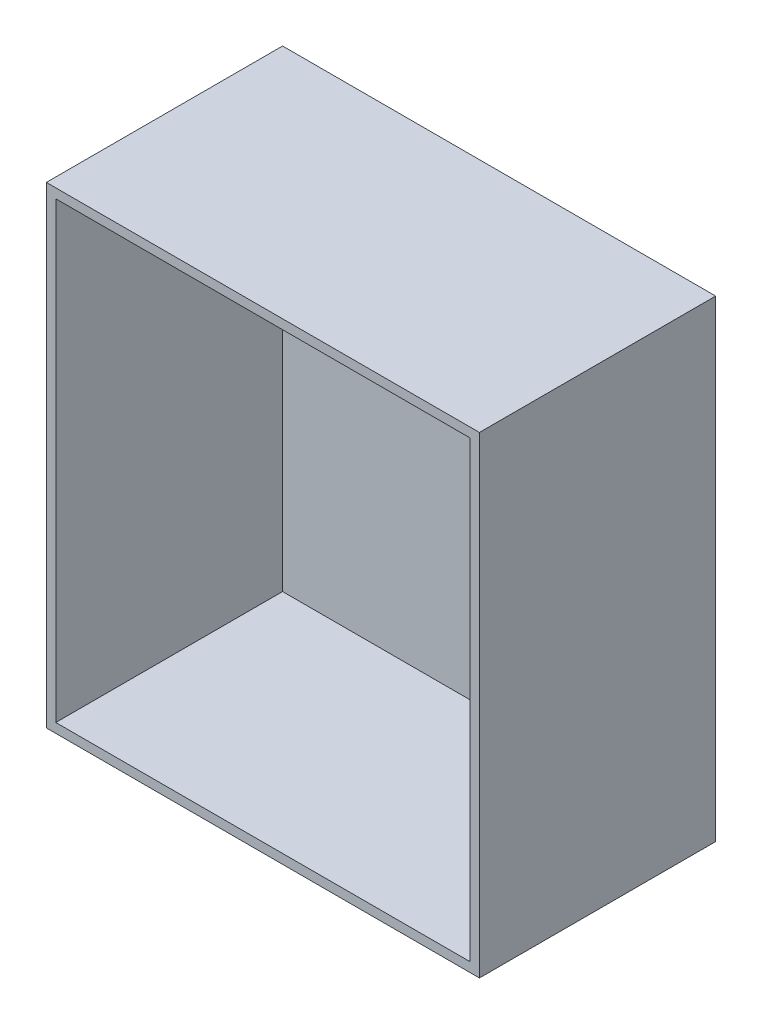
ISO-10303-21;
HEADER;
FILE_DESCRIPTION(('STEP AP214'),'2;1');
FILE_NAME('part.step','',(''),(''),'','','');
FILE_SCHEMA(('AUTOMOTIVE_DESIGN { 1 0 10303 214 1 1 1 1 }'));
ENDSEC;
DATA;
#1=APPLICATION_CONTEXT('core data for automotive mechanical design processes');
#2=APPLICATION_PROTOCOL_DEFINITION('international standard','automotive_design',2000,#1);
#3=PRODUCT_CONTEXT('',#1,'mechanical');
#4=PRODUCT('Part','Part','',(#3));
#5=PRODUCT_RELATED_PRODUCT_CATEGORY('part','',(#4));
#6=PRODUCT_DEFINITION_FORMATION('','',#4);
#7=PRODUCT_DEFINITION_CONTEXT('part definition',#1,'design');
#8=PRODUCT_DEFINITION('design','',#6,#7);
#9=PRODUCT_DEFINITION_SHAPE('','',#8);
#10=(LENGTH_UNIT() NAMED_UNIT(*) SI_UNIT(.MILLI.,.METRE.));
#11=(NAMED_UNIT(*) PLANE_ANGLE_UNIT() SI_UNIT($,.RADIAN.));
#12=(NAMED_UNIT(*) SI_UNIT($,.STERADIAN.) SOLID_ANGLE_UNIT());
#13=UNCERTAINTY_MEASURE_WITH_UNIT(LENGTH_MEASURE(1.E-05),#10,'distance_accuracy_value','');
#14=(GEOMETRIC_REPRESENTATION_CONTEXT(3) GLOBAL_UNCERTAINTY_ASSIGNED_CONTEXT((#13)) GLOBAL_UNIT_ASSIGNED_CONTEXT((#10,
#11,#12)) REPRESENTATION_CONTEXT('',''));
#15=CARTESIAN_POINT('',(0.,0.,0.));
#16=DIRECTION('',(0.,0.,1.));
#17=DIRECTION('',(1.,0.,0.));
#18=AXIS2_PLACEMENT_3D('',#15,#16,#17);
#19=CARTESIAN_POINT('',(-52.6,-57.6,2.4));
#20=DIRECTION('',(0.,0.,1.));
#21=DIRECTION('',(1.,0.,0.));
#22=AXIS2_PLACEMENT_3D('',#19,#20,#21);
#23=PLANE('',#22);
#24=DIRECTION('',(0.,1.,0.));
#25=VECTOR('',#24,1.);
#26=CARTESIAN_POINT('',(-52.6,-57.6,2.4));
#27=LINE('',#26,#25);
#28=CARTESIAN_POINT('',(-52.6,-57.6,2.4));
#29=VERTEX_POINT('',#28);
#30=CARTESIAN_POINT('',(-52.6,57.6,2.4));
#31=VERTEX_POINT('',#30);
#32=EDGE_CURVE('E10',#29,#31,#27,.T.);
#33=ORIENTED_EDGE('',*,*,#32,.F.);
#34=DIRECTION('',(1.,0.,0.));
#35=VECTOR('',#34,1.);
#36=CARTESIAN_POINT('',(-52.6,-57.6,2.4));
#37=LINE('',#36,#35);
#38=CARTESIAN_POINT('',(52.6,-57.6,2.4));
#39=VERTEX_POINT('',#38);
#40=EDGE_CURVE('E202',#29,#39,#37,.T.);
#41=ORIENTED_EDGE('',*,*,#40,.T.);
#42=DIRECTION('',(0.,1.,0.));
#43=VECTOR('',#42,1.);
#44=CARTESIAN_POINT('',(52.6,-57.6,2.4));
#45=LINE('',#44,#43);
#46=CARTESIAN_POINT('',(52.6,57.6,2.4));
#47=VERTEX_POINT('',#46);
#48=EDGE_CURVE('E239',#39,#47,#45,.T.);
#49=ORIENTED_EDGE('',*,*,#48,.T.);
#50=DIRECTION('',(1.,0.,0.));
#51=VECTOR('',#50,1.);
#52=CARTESIAN_POINT('',(-52.6,57.6,2.4));
#53=LINE('',#52,#51);
#54=EDGE_CURVE('E25',#31,#47,#53,.T.);
#55=ORIENTED_EDGE('',*,*,#54,.F.);
#56=EDGE_LOOP('',(#33,#41,#49,#55));
#57=FACE_BOUND('',#56,.T.);
#58=ADVANCED_FACE('F16',(#57),#23,.T.);
#59=CARTESIAN_POINT('',(0.,-68.,9.));
#60=DIRECTION('',(0.,0.,1.));
#61=DIRECTION('',(1.,0.,0.));
#62=AXIS2_PLACEMENT_3D('',#59,#60,#61);
#63=CYLINDRICAL_SURFACE('',#62,3.1);
#64=CARTESIAN_POINT('',(0.,-68.,16.));
#65=DIRECTION('',(0.,0.,1.));
#66=DIRECTION('',(1.,0.,0.));
#67=AXIS2_PLACEMENT_3D('',#64,#65,#66);
#68=CIRCLE('',#67,3.1);
#69=CARTESIAN_POINT('',(3.1,-68.,16.));
#70=VERTEX_POINT('',#69);
#71=EDGE_CURVE('E147',#70,#70,#68,.T.);
#72=ORIENTED_EDGE('',*,*,#71,.T.);
#73=EDGE_LOOP('',(#72));
#74=FACE_BOUND('',#73,.T.);
#75=CARTESIAN_POINT('',(0.,-68.,10.));
#76=DIRECTION('',(0.,0.,1.));
#77=DIRECTION('',(1.,0.,0.));
#78=AXIS2_PLACEMENT_3D('',#75,#76,#77);
#79=CIRCLE('',#78,3.1);
#80=CARTESIAN_POINT('',(3.1,-68.,10.));
#81=VERTEX_POINT('',#80);
#82=EDGE_CURVE('E230',#81,#81,#79,.T.);
#83=ORIENTED_EDGE('',*,*,#82,.F.);
#84=EDGE_LOOP('',(#83));
#85=FACE_BOUND('',#84,.T.);
#86=ADVANCED_FACE('F322',(#74,#85),#63,.F.);
#87=CARTESIAN_POINT('',(-16.,-76.,10.));
#88=DIRECTION('',(0.,1.,0.));
#89=DIRECTION('',(1.,0.,0.));
#90=AXIS2_PLACEMENT_3D('',#87,#88,#89);
#91=PLANE('',#90);
#92=DIRECTION('',(0.,0.,1.));
#93=VECTOR('',#92,1.);
#94=CARTESIAN_POINT('',(16.,-76.,10.));
#95=LINE('',#94,#93);
#96=CARTESIAN_POINT('',(16.,-76.,10.));
#97=VERTEX_POINT('',#96);
#98=CARTESIAN_POINT('',(16.,-76.,16.));
#99=VERTEX_POINT('',#98);
#100=EDGE_CURVE('E189',#97,#99,#95,.T.);
#101=ORIENTED_EDGE('',*,*,#100,.T.);
#102=DIRECTION('',(1.,0.,0.));
#103=VECTOR('',#102,1.);
#104=CARTESIAN_POINT('',(-16.,-76.,16.));
#105=LINE('',#104,#103);
#106=CARTESIAN_POINT('',(-16.,-76.,16.));
#107=VERTEX_POINT('',#106);
#108=EDGE_CURVE('E142',#107,#99,#105,.T.);
#109=ORIENTED_EDGE('',*,*,#108,.F.);
#110=DIRECTION('',(0.,0.,1.));
#111=VECTOR('',#110,1.);
#112=CARTESIAN_POINT('',(-16.,-76.,10.));
#113=LINE('',#112,#111);
#114=CARTESIAN_POINT('',(-16.,-76.,10.));
#115=VERTEX_POINT('',#114);
#116=EDGE_CURVE('E203',#115,#107,#113,.T.);
#117=ORIENTED_EDGE('',*,*,#116,.F.);
#118=DIRECTION('',(1.,0.,0.));
#119=VECTOR('',#118,1.);
#120=CARTESIAN_POINT('',(-16.,-76.,10.));
#121=LINE('',#120,#119);
#122=EDGE_CURVE('E222',#115,#97,#121,.T.);
#123=ORIENTED_EDGE('',*,*,#122,.T.);
#124=EDGE_LOOP('',(#101,#109,#117,#123));
#125=FACE_BOUND('',#124,.T.);
#126=ADVANCED_FACE('F320',(#125),#91,.F.);
#127=CARTESIAN_POINT('',(-52.6,-57.6,2.4));
#128=DIRECTION('',(1.,0.,0.));
#129=DIRECTION('',(0.,1.,0.));
#130=AXIS2_PLACEMENT_3D('',#127,#128,#129);
#131=PLANE('',#130);
#132=DIRECTION('',(0.,0.,1.));
#133=VECTOR('',#132,1.);
#134=CARTESIAN_POINT('',(-52.6,-57.6,2.4));
#135=LINE('',#134,#133);
#136=CARTESIAN_POINT('',(-52.6,-57.6,60.));
#137=VERTEX_POINT('',#136);
#138=EDGE_CURVE('E226',#29,#137,#135,.T.);
#139=ORIENTED_EDGE('',*,*,#138,.F.);
#140=ORIENTED_EDGE('',*,*,#32,.T.);
#141=DIRECTION('',(0.,0.,1.));
#142=VECTOR('',#141,1.);
#143=CARTESIAN_POINT('',(-52.6,57.6,2.4));
#144=LINE('',#143,#142);
#145=CARTESIAN_POINT('',(-52.6,57.6,60.));
#146=VERTEX_POINT('',#145);
#147=EDGE_CURVE('E19',#31,#146,#144,.T.);
#148=ORIENTED_EDGE('',*,*,#147,.T.);
#149=DIRECTION('',(0.,1.,0.));
#150=VECTOR('',#149,1.);
#151=CARTESIAN_POINT('',(-52.6,-58.8,60.));
#152=LINE('',#151,#150);
#153=EDGE_CURVE('E183',#137,#146,#152,.T.);
#154=ORIENTED_EDGE('',*,*,#153,.F.);
#155=EDGE_LOOP('',(#139,#140,#148,#154));
#156=FACE_BOUND('',#155,.T.);
#157=ADVANCED_FACE('F249',(#156),#131,.T.);
#158=CARTESIAN_POINT('',(-52.6,57.6,2.4));
#159=DIRECTION('',(0.,1.,0.));
#160=DIRECTION('',(1.,0.,0.));
#161=AXIS2_PLACEMENT_3D('',#158,#159,#160);
#162=PLANE('',#161);
#163=DIRECTION('',(-1.,0.,0.));
#164=VECTOR('',#163,1.);
#165=CARTESIAN_POINT('',(-53.8,57.6,60.));
#166=LINE('',#165,#164);
#167=CARTESIAN_POINT('',(52.6,57.6,60.));
#168=VERTEX_POINT('',#167);
#169=EDGE_CURVE('E186',#168,#146,#166,.T.);
#170=ORIENTED_EDGE('',*,*,#169,.T.);
#171=ORIENTED_EDGE('',*,*,#147,.F.);
#172=ORIENTED_EDGE('',*,*,#54,.T.);
#173=DIRECTION('',(0.,0.,1.));
#174=VECTOR('',#173,1.);
#175=CARTESIAN_POINT('',(52.6,57.6,2.4));
#176=LINE('',#175,#174);
#177=EDGE_CURVE('E236',#47,#168,#176,.T.);
#178=ORIENTED_EDGE('',*,*,#177,.T.);
#179=EDGE_LOOP('',(#170,#171,#172,#178));
#180=FACE_BOUND('',#179,.T.);
#181=ADVANCED_FACE('F252',(#180),#162,.F.);
#182=CARTESIAN_POINT('',(52.6,-57.6,2.4));
#183=DIRECTION('',(1.,0.,0.));
#184=DIRECTION('',(0.,1.,0.));
#185=AXIS2_PLACEMENT_3D('',#182,#183,#184);
#186=PLANE('',#185);
#187=DIRECTION('',(0.,1.,0.));
#188=VECTOR('',#187,1.);
#189=CARTESIAN_POINT('',(52.6,-58.8,60.));
#190=LINE('',#189,#188);
#191=CARTESIAN_POINT('',(52.6,-57.6,60.));
#192=VERTEX_POINT('',#191);
#193=EDGE_CURVE('E177',#192,#168,#190,.T.);
#194=ORIENTED_EDGE('',*,*,#193,.T.);
#195=ORIENTED_EDGE('',*,*,#177,.F.);
#196=ORIENTED_EDGE('',*,*,#48,.F.);
#197=DIRECTION('',(0.,0.,1.));
#198=VECTOR('',#197,1.);
#199=CARTESIAN_POINT('',(52.6,-57.6,2.4));
#200=LINE('',#199,#198);
#201=EDGE_CURVE('E199',#39,#192,#200,.T.);
#202=ORIENTED_EDGE('',*,*,#201,.T.);
#203=EDGE_LOOP('',(#194,#195,#196,#202));
#204=FACE_BOUND('',#203,.T.);
#205=ADVANCED_FACE('F337',(#204),#186,.F.);
#206=CARTESIAN_POINT('',(-52.6,-57.6,2.4));
#207=DIRECTION('',(0.,1.,0.));
#208=DIRECTION('',(1.,0.,0.));
#209=AXIS2_PLACEMENT_3D('',#206,#207,#208);
#210=PLANE('',#209);
#211=ORIENTED_EDGE('',*,*,#201,.F.);
#212=ORIENTED_EDGE('',*,*,#40,.F.);
#213=ORIENTED_EDGE('',*,*,#138,.T.);
#214=DIRECTION('',(-1.,0.,0.));
#215=VECTOR('',#214,1.);
#216=CARTESIAN_POINT('',(-53.8,-57.6,60.));
#217=LINE('',#216,#215);
#218=EDGE_CURVE('E187',#192,#137,#217,.T.);
#219=ORIENTED_EDGE('',*,*,#218,.F.);
#220=EDGE_LOOP('',(#211,#212,#213,#219));
#221=FACE_BOUND('',#220,.T.);
#222=ADVANCED_FACE('F335',(#221),#210,.T.);
#223=CARTESIAN_POINT('',(-16.,-76.,10.));
#224=DIRECTION('',(1.,0.,0.));
#225=DIRECTION('',(0.,1.,0.));
#226=AXIS2_PLACEMENT_3D('',#223,#224,#225);
#227=PLANE('',#226);
#228=DIRECTION('',(0.,0.,-1.));
#229=VECTOR('',#228,1.);
#230=CARTESIAN_POINT('',(-16.,-60.,5.));
#231=LINE('',#230,#229);
#232=CARTESIAN_POINT('',(-16.,-60.,16.));
#233=VERTEX_POINT('',#232);
#234=CARTESIAN_POINT('',(-16.,-60.,10.));
#235=VERTEX_POINT('',#234);
#236=EDGE_CURVE('E156',#233,#235,#231,.T.);
#237=ORIENTED_EDGE('',*,*,#236,.T.);
#238=DIRECTION('',(0.,1.,0.));
#239=VECTOR('',#238,1.);
#240=CARTESIAN_POINT('',(-16.,-76.,10.));
#241=LINE('',#240,#239);
#242=EDGE_CURVE('E229',#115,#235,#241,.T.);
#243=ORIENTED_EDGE('',*,*,#242,.F.);
#244=ORIENTED_EDGE('',*,*,#116,.T.);
#245=DIRECTION('',(0.,1.,0.));
#246=VECTOR('',#245,1.);
#247=CARTESIAN_POINT('',(-16.,-76.,16.));
#248=LINE('',#247,#246);
#249=EDGE_CURVE('E213',#107,#233,#248,.T.);
#250=ORIENTED_EDGE('',*,*,#249,.T.);
#251=EDGE_LOOP('',(#237,#243,#244,#250));
#252=FACE_BOUND('',#251,.T.);
#253=ADVANCED_FACE('F314',(#252),#227,.F.);
#254=CARTESIAN_POINT('',(-16.,-76.,10.));
#255=DIRECTION('',(0.,0.,1.));
#256=DIRECTION('',(1.,0.,0.));
#257=AXIS2_PLACEMENT_3D('',#254,#255,#256);
#258=PLANE('',#257);
#259=ORIENTED_EDGE('',*,*,#82,.T.);
#260=EDGE_LOOP('',(#259));
#261=FACE_BOUND('',#260,.T.);
#262=DIRECTION('',(1.,0.,0.));
#263=VECTOR('',#262,1.);
#264=CARTESIAN_POINT('',(-35.5,-60.,10.));
#265=LINE('',#264,#263);
#266=CARTESIAN_POINT('',(16.,-60.,10.));
#267=VERTEX_POINT('',#266);
#268=EDGE_CURVE('E165',#235,#267,#265,.T.);
#269=ORIENTED_EDGE('',*,*,#268,.T.);
#270=DIRECTION('',(0.,1.,0.));
#271=VECTOR('',#270,1.);
#272=CARTESIAN_POINT('',(16.,-76.,10.));
#273=LINE('',#272,#271);
#274=EDGE_CURVE('E162',#97,#267,#273,.T.);
#275=ORIENTED_EDGE('',*,*,#274,.F.);
#276=ORIENTED_EDGE('',*,*,#122,.F.);
#277=ORIENTED_EDGE('',*,*,#242,.T.);
#278=EDGE_LOOP('',(#269,#275,#276,#277));
#279=FACE_BOUND('',#278,.T.);
#280=ADVANCED_FACE('F312',(#261,#279),#258,.F.);
#281=CARTESIAN_POINT('',(16.,-76.,10.));
#282=DIRECTION('',(1.,0.,0.));
#283=DIRECTION('',(0.,1.,0.));
#284=AXIS2_PLACEMENT_3D('',#281,#282,#283);
#285=PLANE('',#284);
#286=DIRECTION('',(0.,1.,0.));
#287=VECTOR('',#286,1.);
#288=CARTESIAN_POINT('',(16.,-76.,16.));
#289=LINE('',#288,#287);
#290=CARTESIAN_POINT('',(16.,-60.,16.));
#291=VERTEX_POINT('',#290);
#292=EDGE_CURVE('E135',#99,#291,#289,.T.);
#293=ORIENTED_EDGE('',*,*,#292,.F.);
#294=ORIENTED_EDGE('',*,*,#100,.F.);
#295=ORIENTED_EDGE('',*,*,#274,.T.);
#296=DIRECTION('',(0.,0.,-1.));
#297=VECTOR('',#296,1.);
#298=CARTESIAN_POINT('',(16.,-60.,5.));
#299=LINE('',#298,#297);
#300=EDGE_CURVE('E154',#291,#267,#299,.T.);
#301=ORIENTED_EDGE('',*,*,#300,.F.);
#302=EDGE_LOOP('',(#293,#294,#295,#301));
#303=FACE_BOUND('',#302,.T.);
#304=ADVANCED_FACE('F160',(#303),#285,.T.);
#305=CARTESIAN_POINT('',(-16.,-76.,16.));
#306=DIRECTION('',(0.,0.,1.));
#307=DIRECTION('',(1.,0.,0.));
#308=AXIS2_PLACEMENT_3D('',#305,#306,#307);
#309=PLANE('',#308);
#310=ORIENTED_EDGE('',*,*,#71,.F.);
#311=EDGE_LOOP('',(#310));
#312=FACE_BOUND('',#311,.T.);
#313=ORIENTED_EDGE('',*,*,#249,.F.);
#314=ORIENTED_EDGE('',*,*,#108,.T.);
#315=ORIENTED_EDGE('',*,*,#292,.T.);
#316=DIRECTION('',(1.,0.,0.));
#317=VECTOR('',#316,1.);
#318=CARTESIAN_POINT('',(-35.5,-60.,16.));
#319=LINE('',#318,#317);
#320=EDGE_CURVE('E139',#233,#291,#319,.T.);
#321=ORIENTED_EDGE('',*,*,#320,.F.);
#322=EDGE_LOOP('',(#313,#314,#315,#321));
#323=FACE_BOUND('',#322,.T.);
#324=ADVANCED_FACE('F138',(#312,#323),#309,.T.);
#325=CARTESIAN_POINT('',(55.,-60.,0.));
#326=DIRECTION('',(1.,0.,0.));
#327=DIRECTION('',(0.,1.,0.));
#328=AXIS2_PLACEMENT_3D('',#325,#326,#327);
#329=PLANE('',#328);
#330=DIRECTION('',(0.,0.,1.));
#331=VECTOR('',#330,1.);
#332=CARTESIAN_POINT('',(55.,-60.,0.));
#333=LINE('',#332,#331);
#334=CARTESIAN_POINT('',(55.,-60.,0.));
#335=VERTEX_POINT('',#334);
#336=CARTESIAN_POINT('',(55.,-60.,60.));
#337=VERTEX_POINT('',#336);
#338=EDGE_CURVE('E280',#335,#337,#333,.T.);
#339=ORIENTED_EDGE('',*,*,#338,.F.);
#340=DIRECTION('',(0.,1.,0.));
#341=VECTOR('',#340,1.);
#342=CARTESIAN_POINT('',(55.,-60.,0.));
#343=LINE('',#342,#341);
#344=CARTESIAN_POINT('',(55.,60.,0.));
#345=VERTEX_POINT('',#344);
#346=EDGE_CURVE('E211',#335,#345,#343,.T.);
#347=ORIENTED_EDGE('',*,*,#346,.T.);
#348=DIRECTION('',(0.,0.,1.));
#349=VECTOR('',#348,1.);
#350=CARTESIAN_POINT('',(55.,60.,0.));
#351=LINE('',#350,#349);
#352=CARTESIAN_POINT('',(55.,60.,60.));
#353=VERTEX_POINT('',#352);
#354=EDGE_CURVE('E208',#345,#353,#351,.T.);
#355=ORIENTED_EDGE('',*,*,#354,.T.);
#356=DIRECTION('',(0.,1.,0.));
#357=VECTOR('',#356,1.);
#358=CARTESIAN_POINT('',(55.,-60.,60.));
#359=LINE('',#358,#357);
#360=EDGE_CURVE('E158',#337,#353,#359,.T.);
#361=ORIENTED_EDGE('',*,*,#360,.F.);
#362=EDGE_LOOP('',(#339,#347,#355,#361));
#363=FACE_BOUND('',#362,.T.);
#364=ADVANCED_FACE('F293',(#363),#329,.T.);
#365=CARTESIAN_POINT('',(-55.,-60.,0.));
#366=DIRECTION('',(0.,0.,1.));
#367=DIRECTION('',(1.,0.,0.));
#368=AXIS2_PLACEMENT_3D('',#365,#366,#367);
#369=PLANE('',#368);
#370=DIRECTION('',(1.,0.,0.));
#371=VECTOR('',#370,1.);
#372=CARTESIAN_POINT('',(-55.,60.,0.));
#373=LINE('',#372,#371);
#374=CARTESIAN_POINT('',(-55.,60.,0.));
#375=VERTEX_POINT('',#374);
#376=EDGE_CURVE('E204',#375,#345,#373,.T.);
#377=ORIENTED_EDGE('',*,*,#376,.T.);
#378=ORIENTED_EDGE('',*,*,#346,.F.);
#379=DIRECTION('',(1.,0.,0.));
#380=VECTOR('',#379,1.);
#381=CARTESIAN_POINT('',(-55.,-60.,0.));
#382=LINE('',#381,#380);
#383=CARTESIAN_POINT('',(-55.,-60.,0.));
#384=VERTEX_POINT('',#383);
#385=EDGE_CURVE('E166',#384,#335,#382,.T.);
#386=ORIENTED_EDGE('',*,*,#385,.F.);
#387=DIRECTION('',(0.,1.,0.));
#388=VECTOR('',#387,1.);
#389=CARTESIAN_POINT('',(-55.,-60.,0.));
#390=LINE('',#389,#388);
#391=EDGE_CURVE('E272',#384,#375,#390,.T.);
#392=ORIENTED_EDGE('',*,*,#391,.T.);
#393=EDGE_LOOP('',(#377,#378,#386,#392));
#394=FACE_BOUND('',#393,.T.);
#395=ADVANCED_FACE('F353',(#394),#369,.F.);
#396=CARTESIAN_POINT('',(-55.,60.,0.));
#397=DIRECTION('',(0.,1.,0.));
#398=DIRECTION('',(1.,0.,0.));
#399=AXIS2_PLACEMENT_3D('',#396,#397,#398);
#400=PLANE('',#399);
#401=ORIENTED_EDGE('',*,*,#376,.F.);
#402=DIRECTION('',(0.,0.,1.));
#403=VECTOR('',#402,1.);
#404=CARTESIAN_POINT('',(-55.,60.,0.));
#405=LINE('',#404,#403);
#406=CARTESIAN_POINT('',(-55.,60.,60.));
#407=VERTEX_POINT('',#406);
#408=EDGE_CURVE('E276',#375,#407,#405,.T.);
#409=ORIENTED_EDGE('',*,*,#408,.T.);
#410=DIRECTION('',(1.,0.,0.));
#411=VECTOR('',#410,1.);
#412=CARTESIAN_POINT('',(-55.,60.,60.));
#413=LINE('',#412,#411);
#414=EDGE_CURVE('E195',#407,#353,#413,.T.);
#415=ORIENTED_EDGE('',*,*,#414,.T.);
#416=ORIENTED_EDGE('',*,*,#354,.F.);
#417=EDGE_LOOP('',(#401,#409,#415,#416));
#418=FACE_BOUND('',#417,.T.);
#419=ADVANCED_FACE('F297',(#418),#400,.T.);
#420=CARTESIAN_POINT('',(-55.,-60.,60.));
#421=DIRECTION('',(0.,0.,1.));
#422=DIRECTION('',(1.,0.,0.));
#423=AXIS2_PLACEMENT_3D('',#420,#421,#422);
#424=PLANE('',#423);
#425=ORIENTED_EDGE('',*,*,#218,.T.);
#426=ORIENTED_EDGE('',*,*,#153,.T.);
#427=ORIENTED_EDGE('',*,*,#169,.F.);
#428=ORIENTED_EDGE('',*,*,#193,.F.);
#429=EDGE_LOOP('',(#425,#426,#427,#428));
#430=FACE_BOUND('',#429,.T.);
#431=DIRECTION('',(0.,1.,0.));
#432=VECTOR('',#431,1.);
#433=CARTESIAN_POINT('',(-55.,-60.,60.));
#434=LINE('',#433,#432);
#435=CARTESIAN_POINT('',(-55.,-60.,60.));
#436=VERTEX_POINT('',#435);
#437=EDGE_CURVE('E289',#436,#407,#434,.T.);
#438=ORIENTED_EDGE('',*,*,#437,.F.);
#439=DIRECTION('',(1.,0.,0.));
#440=VECTOR('',#439,1.);
#441=CARTESIAN_POINT('',(-55.,-60.,60.));
#442=LINE('',#441,#440);
#443=EDGE_CURVE('E174',#436,#337,#442,.T.);
#444=ORIENTED_EDGE('',*,*,#443,.T.);
#445=ORIENTED_EDGE('',*,*,#360,.T.);
#446=ORIENTED_EDGE('',*,*,#414,.F.);
#447=EDGE_LOOP('',(#438,#444,#445,#446));
#448=FACE_BOUND('',#447,.T.);
#449=ADVANCED_FACE('F256',(#430,#448),#424,.T.);
#450=CARTESIAN_POINT('',(-55.,-60.,0.));
#451=DIRECTION('',(0.,1.,0.));
#452=DIRECTION('',(1.,0.,0.));
#453=AXIS2_PLACEMENT_3D('',#450,#451,#452);
#454=PLANE('',#453);
#455=ORIENTED_EDGE('',*,*,#300,.T.);
#456=ORIENTED_EDGE('',*,*,#268,.F.);
#457=ORIENTED_EDGE('',*,*,#236,.F.);
#458=ORIENTED_EDGE('',*,*,#320,.T.);
#459=EDGE_LOOP('',(#455,#456,#457,#458));
#460=FACE_BOUND('',#459,.T.);
#461=ORIENTED_EDGE('',*,*,#338,.T.);
#462=ORIENTED_EDGE('',*,*,#443,.F.);
#463=DIRECTION('',(0.,0.,1.));
#464=VECTOR('',#463,1.);
#465=CARTESIAN_POINT('',(-55.,-60.,0.));
#466=LINE('',#465,#464);
#467=EDGE_CURVE('E275',#384,#436,#466,.T.);
#468=ORIENTED_EDGE('',*,*,#467,.F.);
#469=ORIENTED_EDGE('',*,*,#385,.T.);
#470=EDGE_LOOP('',(#461,#462,#468,#469));
#471=FACE_BOUND('',#470,.T.);
#472=ADVANCED_FACE('F151',(#460,#471),#454,.F.);
#473=CARTESIAN_POINT('',(-55.,-60.,0.));
#474=DIRECTION('',(1.,0.,0.));
#475=DIRECTION('',(0.,1.,0.));
#476=AXIS2_PLACEMENT_3D('',#473,#474,#475);
#477=PLANE('',#476);
#478=ORIENTED_EDGE('',*,*,#437,.T.);
#479=ORIENTED_EDGE('',*,*,#408,.F.);
#480=ORIENTED_EDGE('',*,*,#391,.F.);
#481=ORIENTED_EDGE('',*,*,#467,.T.);
#482=EDGE_LOOP('',(#478,#479,#480,#481));
#483=FACE_BOUND('',#482,.T.);
#484=ADVANCED_FACE('F302',(#483),#477,.F.);
#485=CLOSED_SHELL('',(#58,#86,#126,#157,#181,#205,#222,#253,#280,#304,#324,#364,#395,#419,#449,
#472,#484));
#486=MANIFOLD_SOLID_BREP('B1',#485);
#487=ADVANCED_BREP_SHAPE_REPRESENTATION('',(#18,#486),#14);
#488=SHAPE_DEFINITION_REPRESENTATION(#9,#487);
ENDSEC;
END-ISO-10303-21;
